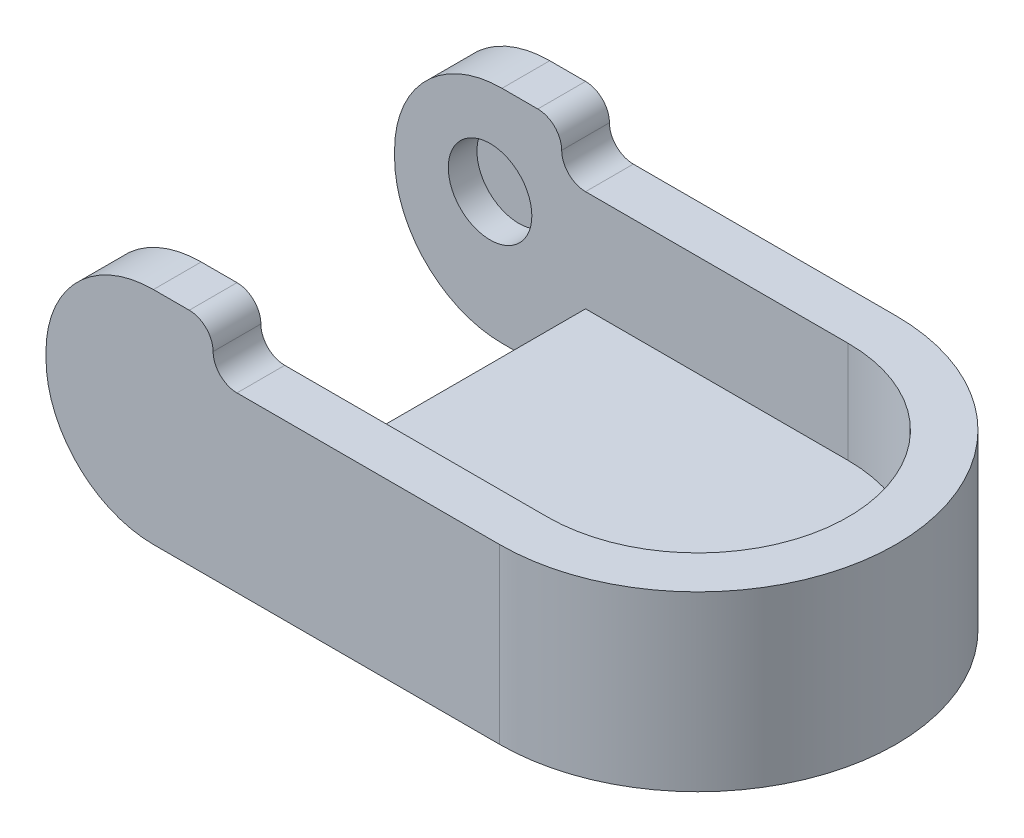
ISO-10303-21;
HEADER;
FILE_DESCRIPTION(('STEP AP214'),'2;1');
FILE_NAME('part.step','',(''),(''),'','','');
FILE_SCHEMA(('AUTOMOTIVE_DESIGN { 1 0 10303 214 1 1 1 1 }'));
ENDSEC;
DATA;
#1=APPLICATION_CONTEXT('core data for automotive mechanical design processes');
#2=APPLICATION_PROTOCOL_DEFINITION('international standard','automotive_design',2000,#1);
#3=PRODUCT_CONTEXT('',#1,'mechanical');
#4=PRODUCT('Part','Part','',(#3));
#5=PRODUCT_RELATED_PRODUCT_CATEGORY('part','',(#4));
#6=PRODUCT_DEFINITION_FORMATION('','',#4);
#7=PRODUCT_DEFINITION_CONTEXT('part definition',#1,'design');
#8=PRODUCT_DEFINITION('design','',#6,#7);
#9=PRODUCT_DEFINITION_SHAPE('','',#8);
#10=(LENGTH_UNIT() NAMED_UNIT(*) SI_UNIT(.MILLI.,.METRE.));
#11=(NAMED_UNIT(*) PLANE_ANGLE_UNIT() SI_UNIT($,.RADIAN.));
#12=(NAMED_UNIT(*) SI_UNIT($,.STERADIAN.) SOLID_ANGLE_UNIT());
#13=UNCERTAINTY_MEASURE_WITH_UNIT(LENGTH_MEASURE(1.E-05),#10,'distance_accuracy_value','');
#14=(GEOMETRIC_REPRESENTATION_CONTEXT(3) GLOBAL_UNCERTAINTY_ASSIGNED_CONTEXT((#13)) GLOBAL_UNIT_ASSIGNED_CONTEXT((#10,
#11,#12)) REPRESENTATION_CONTEXT('',''));
#15=CARTESIAN_POINT('',(0.,0.,0.));
#16=DIRECTION('',(0.,0.,1.));
#17=DIRECTION('',(1.,0.,0.));
#18=AXIS2_PLACEMENT_3D('',#15,#16,#17);
#19=CARTESIAN_POINT('',(0.,3.,0.));
#20=DIRECTION('',(0.,0.,-1.));
#21=DIRECTION('',(-1.,0.,0.));
#22=AXIS2_PLACEMENT_3D('',#19,#20,#21);
#23=PLANE('',#22);
#24=DIRECTION('',(1.,0.,0.));
#25=VECTOR('',#24,1.);
#26=CARTESIAN_POINT('',(0.,7.25,0.));
#27=LINE('',#26,#25);
#28=CARTESIAN_POINT('',(6.,7.25,0.));
#29=VERTEX_POINT('',#28);
#30=CARTESIAN_POINT('',(17.,7.25,0.));
#31=VERTEX_POINT('',#30);
#32=EDGE_CURVE('E213',#29,#31,#27,.T.);
#33=ORIENTED_EDGE('',*,*,#32,.F.);
#34=CARTESIAN_POINT('',(6.,8.25,0.));
#35=DIRECTION('',(0.,0.,-1.));
#36=DIRECTION('',(-1.,0.,0.));
#37=AXIS2_PLACEMENT_3D('',#34,#35,#36);
#38=CIRCLE('',#37,1.);
#39=CARTESIAN_POINT('',(5.,8.25,0.));
#40=VERTEX_POINT('',#39);
#41=EDGE_CURVE('E335',#29,#40,#38,.T.);
#42=ORIENTED_EDGE('',*,*,#41,.T.);
#43=CARTESIAN_POINT('',(4.,8.25,0.));
#44=DIRECTION('',(0.,0.,-1.));
#45=DIRECTION('',(-1.,0.,0.));
#46=AXIS2_PLACEMENT_3D('',#43,#44,#45);
#47=CIRCLE('',#46,1.);
#48=CARTESIAN_POINT('',(4.,9.25,0.));
#49=VERTEX_POINT('',#48);
#50=EDGE_CURVE('E325',#40,#49,#47,.F.);
#51=ORIENTED_EDGE('',*,*,#50,.T.);
#52=DIRECTION('',(-1.,0.,0.));
#53=VECTOR('',#52,1.);
#54=CARTESIAN_POINT('',(5.,9.25,0.));
#55=LINE('',#54,#53);
#56=CARTESIAN_POINT('',(2.5,9.25,0.));
#57=VERTEX_POINT('',#56);
#58=EDGE_CURVE('E492',#49,#57,#55,.T.);
#59=ORIENTED_EDGE('',*,*,#58,.T.);
#60=CARTESIAN_POINT('',(2.5,4.75,0.));
#61=DIRECTION('',(0.,0.,-1.));
#62=DIRECTION('',(-1.,0.,0.));
#63=AXIS2_PLACEMENT_3D('',#60,#61,#62);
#64=CIRCLE('',#63,4.5);
#65=CARTESIAN_POINT('',(-2.,4.75,0.));
#66=VERTEX_POINT('',#65);
#67=EDGE_CURVE('E283',#57,#66,#64,.F.);
#68=ORIENTED_EDGE('',*,*,#67,.T.);
#69=DIRECTION('',(0.,-1.,0.));
#70=VECTOR('',#69,1.);
#71=CARTESIAN_POINT('',(-2.,9.25,0.));
#72=LINE('',#71,#70);
#73=CARTESIAN_POINT('',(-2.,4.5,0.));
#74=VERTEX_POINT('',#73);
#75=EDGE_CURVE('E488',#66,#74,#72,.T.);
#76=ORIENTED_EDGE('',*,*,#75,.T.);
#77=CARTESIAN_POINT('',(2.5,4.5,0.));
#78=DIRECTION('',(0.,0.,-1.));
#79=DIRECTION('',(-1.,0.,0.));
#80=AXIS2_PLACEMENT_3D('',#77,#78,#79);
#81=CIRCLE('',#80,4.5);
#82=CARTESIAN_POINT('',(2.5,0.,0.));
#83=VERTEX_POINT('',#82);
#84=EDGE_CURVE('E285',#74,#83,#81,.F.);
#85=ORIENTED_EDGE('',*,*,#84,.T.);
#86=DIRECTION('',(1.,0.,0.));
#87=VECTOR('',#86,1.);
#88=CARTESIAN_POINT('',(0.,0.,0.));
#89=LINE('',#88,#87);
#90=CARTESIAN_POINT('',(17.,0.,0.));
#91=VERTEX_POINT('',#90);
#92=EDGE_CURVE('E222',#83,#91,#89,.T.);
#93=ORIENTED_EDGE('',*,*,#92,.T.);
#94=DIRECTION('',(0.,-1.,0.));
#95=VECTOR('',#94,1.);
#96=CARTESIAN_POINT('',(17.,3.,0.));
#97=LINE('',#96,#95);
#98=EDGE_CURVE('E248',#31,#91,#97,.T.);
#99=ORIENTED_EDGE('',*,*,#98,.F.);
#100=EDGE_LOOP('',(#33,#42,#51,#59,#68,#76,#85,#93,#99));
#101=FACE_BOUND('',#100,.T.);
#102=ADVANCED_FACE('F42',(#101),#23,.F.);
#103=CARTESIAN_POINT('',(17.,3.,-8.3));
#104=DIRECTION('',(0.,-1.,0.));
#105=DIRECTION('',(0.,0.,-1.));
#106=AXIS2_PLACEMENT_3D('',#103,#104,#105);
#107=CYLINDRICAL_SURFACE('',#106,8.3);
#108=CARTESIAN_POINT('',(17.,0.,-8.3));
#109=DIRECTION('',(0.,1.,0.));
#110=DIRECTION('',(0.,0.,1.));
#111=AXIS2_PLACEMENT_3D('',#108,#109,#110);
#112=CIRCLE('',#111,8.3);
#113=CARTESIAN_POINT('',(17.,0.,-16.6));
#114=VERTEX_POINT('',#113);
#115=EDGE_CURVE('E258',#91,#114,#112,.T.);
#116=ORIENTED_EDGE('',*,*,#115,.T.);
#117=DIRECTION('',(0.,-1.,0.));
#118=VECTOR('',#117,1.);
#119=CARTESIAN_POINT('',(17.,3.,-16.6));
#120=LINE('',#119,#118);
#121=CARTESIAN_POINT('',(17.,7.25,-16.6));
#122=VERTEX_POINT('',#121);
#123=EDGE_CURVE('E274',#122,#114,#120,.T.);
#124=ORIENTED_EDGE('',*,*,#123,.F.);
#125=CARTESIAN_POINT('',(17.,7.25,-8.3));
#126=DIRECTION('',(0.,1.,0.));
#127=DIRECTION('',(0.,0.,1.));
#128=AXIS2_PLACEMENT_3D('',#125,#126,#127);
#129=CIRCLE('',#128,8.3);
#130=EDGE_CURVE('E239',#31,#122,#129,.T.);
#131=ORIENTED_EDGE('',*,*,#130,.F.);
#132=ORIENTED_EDGE('',*,*,#98,.T.);
#133=EDGE_LOOP('',(#116,#124,#131,#132));
#134=FACE_BOUND('',#133,.T.);
#135=ADVANCED_FACE('F396',(#134),#107,.T.);
#136=CARTESIAN_POINT('',(17.,3.,-16.6));
#137=DIRECTION('',(0.,0.,1.));
#138=DIRECTION('',(1.,0.,0.));
#139=AXIS2_PLACEMENT_3D('',#136,#137,#138);
#140=PLANE('',#139);
#141=DIRECTION('',(1.,0.,0.));
#142=VECTOR('',#141,1.);
#143=CARTESIAN_POINT('',(5.,9.25,-16.6));
#144=LINE('',#143,#142);
#145=CARTESIAN_POINT('',(2.5,9.25,-16.6));
#146=VERTEX_POINT('',#145);
#147=CARTESIAN_POINT('',(4.,9.25,-16.6));
#148=VERTEX_POINT('',#147);
#149=EDGE_CURVE('E786',#146,#148,#144,.T.);
#150=ORIENTED_EDGE('',*,*,#149,.T.);
#151=CARTESIAN_POINT('',(4.,8.25,-16.6));
#152=DIRECTION('',(0.,0.,1.));
#153=DIRECTION('',(1.,0.,0.));
#154=AXIS2_PLACEMENT_3D('',#151,#152,#153);
#155=CIRCLE('',#154,1.);
#156=CARTESIAN_POINT('',(5.,8.25,-16.6));
#157=VERTEX_POINT('',#156);
#158=EDGE_CURVE('E321',#148,#157,#155,.F.);
#159=ORIENTED_EDGE('',*,*,#158,.T.);
#160=CARTESIAN_POINT('',(6.,8.25,-16.6));
#161=DIRECTION('',(0.,0.,1.));
#162=DIRECTION('',(1.,0.,0.));
#163=AXIS2_PLACEMENT_3D('',#160,#161,#162);
#164=CIRCLE('',#163,1.);
#165=CARTESIAN_POINT('',(6.,7.25,-16.6));
#166=VERTEX_POINT('',#165);
#167=EDGE_CURVE('E331',#157,#166,#164,.T.);
#168=ORIENTED_EDGE('',*,*,#167,.T.);
#169=DIRECTION('',(-1.,0.,0.));
#170=VECTOR('',#169,1.);
#171=CARTESIAN_POINT('',(0.,7.25,-16.6));
#172=LINE('',#171,#170);
#173=EDGE_CURVE('E242',#122,#166,#172,.T.);
#174=ORIENTED_EDGE('',*,*,#173,.F.);
#175=ORIENTED_EDGE('',*,*,#123,.T.);
#176=DIRECTION('',(-1.,0.,0.));
#177=VECTOR('',#176,1.);
#178=CARTESIAN_POINT('',(17.,0.,-16.6));
#179=LINE('',#178,#177);
#180=CARTESIAN_POINT('',(2.5,0.,-16.6));
#181=VERTEX_POINT('',#180);
#182=EDGE_CURVE('E260',#114,#181,#179,.T.);
#183=ORIENTED_EDGE('',*,*,#182,.T.);
#184=CARTESIAN_POINT('',(2.5,4.5,-16.6));
#185=DIRECTION('',(0.,0.,1.));
#186=DIRECTION('',(1.,0.,0.));
#187=AXIS2_PLACEMENT_3D('',#184,#185,#186);
#188=CIRCLE('',#187,4.5);
#189=CARTESIAN_POINT('',(-2.,4.5,-16.6));
#190=VERTEX_POINT('',#189);
#191=EDGE_CURVE('E299',#181,#190,#188,.F.);
#192=ORIENTED_EDGE('',*,*,#191,.T.);
#193=DIRECTION('',(0.,1.,0.));
#194=VECTOR('',#193,1.);
#195=CARTESIAN_POINT('',(-2.,9.25,-16.6));
#196=LINE('',#195,#194);
#197=CARTESIAN_POINT('',(-2.,4.75,-16.6));
#198=VERTEX_POINT('',#197);
#199=EDGE_CURVE('E342',#190,#198,#196,.T.);
#200=ORIENTED_EDGE('',*,*,#199,.T.);
#201=CARTESIAN_POINT('',(2.5,4.75,-16.6));
#202=DIRECTION('',(0.,0.,1.));
#203=DIRECTION('',(1.,0.,0.));
#204=AXIS2_PLACEMENT_3D('',#201,#202,#203);
#205=CIRCLE('',#204,4.5);
#206=EDGE_CURVE('E297',#198,#146,#205,.F.);
#207=ORIENTED_EDGE('',*,*,#206,.T.);
#208=EDGE_LOOP('',(#150,#159,#168,#174,#175,#183,#192,#200,#207));
#209=FACE_BOUND('',#208,.T.);
#210=ADVANCED_FACE('F402',(#209),#140,.F.);
#211=CARTESIAN_POINT('',(0.,3.,-14.6));
#212=DIRECTION('',(0.,0.,-1.));
#213=DIRECTION('',(-1.,0.,0.));
#214=AXIS2_PLACEMENT_3D('',#211,#212,#213);
#215=PLANE('',#214);
#216=DIRECTION('',(1.,0.,0.));
#217=VECTOR('',#216,1.);
#218=CARTESIAN_POINT('',(0.,7.25,-14.6));
#219=LINE('',#218,#217);
#220=CARTESIAN_POINT('',(6.,7.25,-14.6));
#221=VERTEX_POINT('',#220);
#222=CARTESIAN_POINT('',(17.,7.25,-14.6));
#223=VERTEX_POINT('',#222);
#224=EDGE_CURVE('E229',#221,#223,#219,.T.);
#225=ORIENTED_EDGE('',*,*,#224,.F.);
#226=CARTESIAN_POINT('',(6.,8.25,-14.6));
#227=DIRECTION('',(0.,0.,-1.));
#228=DIRECTION('',(-1.,0.,0.));
#229=AXIS2_PLACEMENT_3D('',#226,#227,#228);
#230=CIRCLE('',#229,1.);
#231=CARTESIAN_POINT('',(5.,8.25,-14.6));
#232=VERTEX_POINT('',#231);
#233=EDGE_CURVE('E333',#221,#232,#230,.T.);
#234=ORIENTED_EDGE('',*,*,#233,.T.);
#235=CARTESIAN_POINT('',(4.,8.25,-14.6));
#236=DIRECTION('',(0.,0.,-1.));
#237=DIRECTION('',(-1.,0.,0.));
#238=AXIS2_PLACEMENT_3D('',#235,#236,#237);
#239=CIRCLE('',#238,1.);
#240=CARTESIAN_POINT('',(4.,9.25,-14.6));
#241=VERTEX_POINT('',#240);
#242=EDGE_CURVE('E323',#232,#241,#239,.F.);
#243=ORIENTED_EDGE('',*,*,#242,.T.);
#244=DIRECTION('',(1.,0.,0.));
#245=VECTOR('',#244,1.);
#246=CARTESIAN_POINT('',(5.,9.25,-14.6));
#247=LINE('',#246,#245);
#248=CARTESIAN_POINT('',(2.5,9.25,-14.6));
#249=VERTEX_POINT('',#248);
#250=EDGE_CURVE('E494',#249,#241,#247,.T.);
#251=ORIENTED_EDGE('',*,*,#250,.F.);
#252=CARTESIAN_POINT('',(2.5,4.75,-14.6));
#253=DIRECTION('',(0.,0.,-1.));
#254=DIRECTION('',(-1.,0.,0.));
#255=AXIS2_PLACEMENT_3D('',#252,#253,#254);
#256=CIRCLE('',#255,4.5);
#257=CARTESIAN_POINT('',(-2.,4.75,-14.6));
#258=VERTEX_POINT('',#257);
#259=EDGE_CURVE('E306',#249,#258,#256,.F.);
#260=ORIENTED_EDGE('',*,*,#259,.T.);
#261=DIRECTION('',(0.,1.,0.));
#262=VECTOR('',#261,1.);
#263=CARTESIAN_POINT('',(-2.,9.25,-14.6));
#264=LINE('',#263,#262);
#265=CARTESIAN_POINT('',(-2.,4.5,-14.6));
#266=VERTEX_POINT('',#265);
#267=EDGE_CURVE('E790',#266,#258,#264,.T.);
#268=ORIENTED_EDGE('',*,*,#267,.F.);
#269=CARTESIAN_POINT('',(2.5,4.5,-14.6));
#270=DIRECTION('',(0.,0.,-1.));
#271=DIRECTION('',(-1.,0.,0.));
#272=AXIS2_PLACEMENT_3D('',#269,#270,#271);
#273=CIRCLE('',#272,4.5);
#274=CARTESIAN_POINT('',(2.5,0.,-14.6));
#275=VERTEX_POINT('',#274);
#276=EDGE_CURVE('E308',#266,#275,#273,.F.);
#277=ORIENTED_EDGE('',*,*,#276,.T.);
#278=DIRECTION('',(1.,0.,0.));
#279=VECTOR('',#278,1.);
#280=CARTESIAN_POINT('',(0.,0.,-14.6));
#281=LINE('',#280,#279);
#282=CARTESIAN_POINT('',(6.,0.,-14.6));
#283=VERTEX_POINT('',#282);
#284=EDGE_CURVE('E263',#275,#283,#281,.T.);
#285=ORIENTED_EDGE('',*,*,#284,.T.);
#286=DIRECTION('',(0.,-1.,0.));
#287=VECTOR('',#286,1.);
#288=CARTESIAN_POINT('',(6.,3.,-14.6));
#289=LINE('',#288,#287);
#290=CARTESIAN_POINT('',(6.,3.,-14.6));
#291=VERTEX_POINT('',#290);
#292=EDGE_CURVE('E271',#291,#283,#289,.T.);
#293=ORIENTED_EDGE('',*,*,#292,.F.);
#294=DIRECTION('',(1.,0.,0.));
#295=VECTOR('',#294,1.);
#296=CARTESIAN_POINT('',(0.,3.,-14.6));
#297=LINE('',#296,#295);
#298=CARTESIAN_POINT('',(17.,3.,-14.6));
#299=VERTEX_POINT('',#298);
#300=EDGE_CURVE('E247',#291,#299,#297,.T.);
#301=ORIENTED_EDGE('',*,*,#300,.T.);
#302=DIRECTION('',(0.,-1.,0.));
#303=VECTOR('',#302,1.);
#304=CARTESIAN_POINT('',(17.,7.25,-14.6));
#305=LINE('',#304,#303);
#306=EDGE_CURVE('E223',#223,#299,#305,.T.);
#307=ORIENTED_EDGE('',*,*,#306,.F.);
#308=EDGE_LOOP('',(#225,#234,#243,#251,#260,#268,#277,#285,#293,#301,#307));
#309=FACE_BOUND('',#308,.T.);
#310=CARTESIAN_POINT('',(2.,5.25,-14.6));
#311=DIRECTION('',(0.,0.,1.));
#312=DIRECTION('',(1.,0.,0.));
#313=AXIS2_PLACEMENT_3D('',#310,#311,#312);
#314=CIRCLE('',#313,1.75);
#315=CARTESIAN_POINT('',(3.75,5.25,-14.6));
#316=VERTEX_POINT('',#315);
#317=EDGE_CURVE('E235',#316,#316,#314,.T.);
#318=ORIENTED_EDGE('',*,*,#317,.F.);
#319=EDGE_LOOP('',(#318));
#320=FACE_BOUND('',#319,.T.);
#321=ADVANCED_FACE('F458',(#309,#320),#215,.F.);
#322=CARTESIAN_POINT('',(6.,3.,-14.6));
#323=DIRECTION('',(1.,0.,0.));
#324=DIRECTION('',(0.,0.,-1.));
#325=AXIS2_PLACEMENT_3D('',#322,#323,#324);
#326=PLANE('',#325);
#327=DIRECTION('',(0.,0.,1.));
#328=VECTOR('',#327,1.);
#329=CARTESIAN_POINT('',(6.,0.,-14.6));
#330=LINE('',#329,#328);
#331=CARTESIAN_POINT('',(6.,0.,-2.));
#332=VERTEX_POINT('',#331);
#333=EDGE_CURVE('E265',#283,#332,#330,.T.);
#334=ORIENTED_EDGE('',*,*,#333,.T.);
#335=DIRECTION('',(0.,-1.,0.));
#336=VECTOR('',#335,1.);
#337=CARTESIAN_POINT('',(6.,3.,-2.));
#338=LINE('',#337,#336);
#339=CARTESIAN_POINT('',(6.,3.,-2.));
#340=VERTEX_POINT('',#339);
#341=EDGE_CURVE('E255',#340,#332,#338,.T.);
#342=ORIENTED_EDGE('',*,*,#341,.F.);
#343=DIRECTION('',(0.,0.,1.));
#344=VECTOR('',#343,1.);
#345=CARTESIAN_POINT('',(6.,3.,-14.6));
#346=LINE('',#345,#344);
#347=EDGE_CURVE('E252',#291,#340,#346,.T.);
#348=ORIENTED_EDGE('',*,*,#347,.F.);
#349=ORIENTED_EDGE('',*,*,#292,.T.);
#350=EDGE_LOOP('',(#334,#342,#348,#349));
#351=FACE_BOUND('',#350,.T.);
#352=ADVANCED_FACE('F505',(#351),#326,.F.);
#353=CARTESIAN_POINT('',(6.,3.,-2.));
#354=DIRECTION('',(0.,0.,1.));
#355=DIRECTION('',(1.,0.,0.));
#356=AXIS2_PLACEMENT_3D('',#353,#354,#355);
#357=PLANE('',#356);
#358=DIRECTION('',(-1.,0.,0.));
#359=VECTOR('',#358,1.);
#360=CARTESIAN_POINT('',(5.,9.25,-2.));
#361=LINE('',#360,#359);
#362=CARTESIAN_POINT('',(4.,9.25,-2.));
#363=VERTEX_POINT('',#362);
#364=CARTESIAN_POINT('',(2.5,9.25,-2.));
#365=VERTEX_POINT('',#364);
#366=EDGE_CURVE('E483',#363,#365,#361,.T.);
#367=ORIENTED_EDGE('',*,*,#366,.F.);
#368=CARTESIAN_POINT('',(4.,8.25,-2.));
#369=DIRECTION('',(0.,0.,1.));
#370=DIRECTION('',(1.,0.,0.));
#371=AXIS2_PLACEMENT_3D('',#368,#369,#370);
#372=CIRCLE('',#371,1.);
#373=CARTESIAN_POINT('',(5.,8.25,-2.));
#374=VERTEX_POINT('',#373);
#375=EDGE_CURVE('E329',#363,#374,#372,.F.);
#376=ORIENTED_EDGE('',*,*,#375,.T.);
#377=CARTESIAN_POINT('',(6.,8.25,-2.));
#378=DIRECTION('',(0.,0.,1.));
#379=DIRECTION('',(1.,0.,0.));
#380=AXIS2_PLACEMENT_3D('',#377,#378,#379);
#381=CIRCLE('',#380,1.);
#382=CARTESIAN_POINT('',(6.,7.25,-2.));
#383=VERTEX_POINT('',#382);
#384=EDGE_CURVE('E208',#374,#383,#381,.T.);
#385=ORIENTED_EDGE('',*,*,#384,.T.);
#386=DIRECTION('',(1.,0.,0.));
#387=VECTOR('',#386,1.);
#388=CARTESIAN_POINT('',(0.,7.25,-2.));
#389=LINE('',#388,#387);
#390=CARTESIAN_POINT('',(17.,7.25,-2.));
#391=VERTEX_POINT('',#390);
#392=EDGE_CURVE('E200',#383,#391,#389,.T.);
#393=ORIENTED_EDGE('',*,*,#392,.T.);
#394=DIRECTION('',(0.,-1.,0.));
#395=VECTOR('',#394,1.);
#396=CARTESIAN_POINT('',(17.,7.25,-2.));
#397=LINE('',#396,#395);
#398=CARTESIAN_POINT('',(17.,3.,-2.));
#399=VERTEX_POINT('',#398);
#400=EDGE_CURVE('E205',#391,#399,#397,.T.);
#401=ORIENTED_EDGE('',*,*,#400,.T.);
#402=DIRECTION('',(1.,0.,0.));
#403=VECTOR('',#402,1.);
#404=CARTESIAN_POINT('',(0.,3.,-2.));
#405=LINE('',#404,#403);
#406=EDGE_CURVE('E245',#340,#399,#405,.T.);
#407=ORIENTED_EDGE('',*,*,#406,.F.);
#408=ORIENTED_EDGE('',*,*,#341,.T.);
#409=DIRECTION('',(-1.,0.,0.));
#410=VECTOR('',#409,1.);
#411=CARTESIAN_POINT('',(6.,0.,-2.));
#412=LINE('',#411,#410);
#413=CARTESIAN_POINT('',(2.5,0.,-2.));
#414=VERTEX_POINT('',#413);
#415=EDGE_CURVE('E256',#332,#414,#412,.T.);
#416=ORIENTED_EDGE('',*,*,#415,.T.);
#417=CARTESIAN_POINT('',(2.5,4.5,-2.));
#418=DIRECTION('',(0.,0.,1.));
#419=DIRECTION('',(1.,0.,0.));
#420=AXIS2_PLACEMENT_3D('',#417,#418,#419);
#421=CIRCLE('',#420,4.5);
#422=CARTESIAN_POINT('',(-2.,4.5,-2.));
#423=VERTEX_POINT('',#422);
#424=EDGE_CURVE('E295',#414,#423,#421,.F.);
#425=ORIENTED_EDGE('',*,*,#424,.T.);
#426=DIRECTION('',(0.,-1.,0.));
#427=VECTOR('',#426,1.);
#428=CARTESIAN_POINT('',(-2.,9.25,-2.));
#429=LINE('',#428,#427);
#430=CARTESIAN_POINT('',(-2.,4.75,-2.));
#431=VERTEX_POINT('',#430);
#432=EDGE_CURVE('E475',#431,#423,#429,.T.);
#433=ORIENTED_EDGE('',*,*,#432,.F.);
#434=CARTESIAN_POINT('',(2.5,4.75,-2.));
#435=DIRECTION('',(0.,0.,1.));
#436=DIRECTION('',(1.,0.,0.));
#437=AXIS2_PLACEMENT_3D('',#434,#435,#436);
#438=CIRCLE('',#437,4.5);
#439=EDGE_CURVE('E292',#431,#365,#438,.F.);
#440=ORIENTED_EDGE('',*,*,#439,.T.);
#441=EDGE_LOOP('',(#367,#376,#385,#393,#401,#407,#408,#416,#425,#433,#440));
#442=FACE_BOUND('',#441,.T.);
#443=CARTESIAN_POINT('',(2.,5.25,-2.));
#444=DIRECTION('',(0.,0.,-1.));
#445=DIRECTION('',(-1.,0.,0.));
#446=AXIS2_PLACEMENT_3D('',#443,#444,#445);
#447=CIRCLE('',#446,1.75);
#448=CARTESIAN_POINT('',(0.25,5.25,-2.));
#449=VERTEX_POINT('',#448);
#450=EDGE_CURVE('E482',#449,#449,#447,.T.);
#451=ORIENTED_EDGE('',*,*,#450,.F.);
#452=EDGE_LOOP('',(#451));
#453=FACE_BOUND('',#452,.T.);
#454=ADVANCED_FACE('F203',(#442,#453),#357,.F.);
#455=CARTESIAN_POINT('',(17.,3.,-8.3));
#456=DIRECTION('',(0.,1.,0.));
#457=DIRECTION('',(0.,0.,1.));
#458=AXIS2_PLACEMENT_3D('',#455,#456,#457);
#459=PLANE('',#458);
#460=ORIENTED_EDGE('',*,*,#300,.F.);
#461=ORIENTED_EDGE('',*,*,#347,.T.);
#462=ORIENTED_EDGE('',*,*,#406,.T.);
#463=CARTESIAN_POINT('',(17.,3.,-8.3));
#464=DIRECTION('',(0.,1.,0.));
#465=DIRECTION('',(0.,0.,1.));
#466=AXIS2_PLACEMENT_3D('',#463,#464,#465);
#467=CIRCLE('',#466,6.3);
#468=EDGE_CURVE('E221',#399,#299,#467,.T.);
#469=ORIENTED_EDGE('',*,*,#468,.T.);
#470=EDGE_LOOP('',(#460,#461,#462,#469));
#471=FACE_BOUND('',#470,.T.);
#472=ADVANCED_FACE('F376',(#471),#459,.T.);
#473=CARTESIAN_POINT('',(17.,0.,-8.3));
#474=DIRECTION('',(0.,1.,0.));
#475=DIRECTION('',(0.,0.,1.));
#476=AXIS2_PLACEMENT_3D('',#473,#474,#475);
#477=PLANE('',#476);
#478=ORIENTED_EDGE('',*,*,#92,.F.);
#479=DIRECTION('',(0.,0.,1.));
#480=VECTOR('',#479,1.);
#481=CARTESIAN_POINT('',(2.5,0.,-2.));
#482=LINE('',#481,#480);
#483=EDGE_CURVE('E290',#83,#414,#482,.F.);
#484=ORIENTED_EDGE('',*,*,#483,.T.);
#485=ORIENTED_EDGE('',*,*,#415,.F.);
#486=ORIENTED_EDGE('',*,*,#333,.F.);
#487=ORIENTED_EDGE('',*,*,#284,.F.);
#488=DIRECTION('',(0.,0.,-1.));
#489=VECTOR('',#488,1.);
#490=CARTESIAN_POINT('',(2.5,0.,-16.6));
#491=LINE('',#490,#489);
#492=EDGE_CURVE('E287',#275,#181,#491,.T.);
#493=ORIENTED_EDGE('',*,*,#492,.T.);
#494=ORIENTED_EDGE('',*,*,#182,.F.);
#495=ORIENTED_EDGE('',*,*,#115,.F.);
#496=EDGE_LOOP('',(#478,#484,#485,#486,#487,#493,#494,#495));
#497=FACE_BOUND('',#496,.T.);
#498=ADVANCED_FACE('F374',(#497),#477,.F.);
#499=CARTESIAN_POINT('',(17.,7.25,-8.3));
#500=DIRECTION('',(0.,-1.,0.));
#501=DIRECTION('',(0.,0.,-1.));
#502=AXIS2_PLACEMENT_3D('',#499,#500,#501);
#503=CYLINDRICAL_SURFACE('',#502,6.3);
#504=DIRECTION('',(0.,-1.,0.));
#505=VECTOR('',#504,1.);
#506=CARTESIAN_POINT('',(22.8,7.25,-10.7596747752498));
#507=LINE('',#506,#505);
#508=CARTESIAN_POINT('',(22.8,5.175,-10.7596747752498));
#509=VERTEX_POINT('',#508);
#510=CARTESIAN_POINT('',(22.8,5.075,-10.7596747752498));
#511=VERTEX_POINT('',#510);
#512=EDGE_CURVE('E348',#509,#511,#507,.T.);
#513=ORIENTED_EDGE('',*,*,#512,.F.);
#514=CARTESIAN_POINT('',(22.8,5.175,-10.7596747752498));
#515=CARTESIAN_POINT('',(22.7999864558682,5.1871264195243,-10.7597042162891));
#516=CARTESIAN_POINT('',(22.8004405231236,5.19921054811083,-10.7586361172509));
#517=CARTESIAN_POINT('',(22.8021592569291,5.22285129238407,-10.7545785440023));
#518=CARTESIAN_POINT('',(22.8034143092716,5.23441244596859,-10.7516118573506));
#519=CARTESIAN_POINT('',(22.8069815336115,5.25943112669933,-10.743151531393));
#520=CARTESIAN_POINT('',(22.809469807881,5.27271778369414,-10.7372351881495));
#521=CARTESIAN_POINT('',(22.8152199529779,5.29812139498308,-10.7234836855973));
#522=CARTESIAN_POINT('',(22.8184855416627,5.31023232131025,-10.715639298485));
#523=CARTESIAN_POINT('',(22.8276241911114,5.34000838790375,-10.6935348001315));
#524=CARTESIAN_POINT('',(22.8339014351518,5.3567524598264,-10.6782142848987));
#525=CARTESIAN_POINT('',(22.8471533489983,5.3876327465902,-10.6454452224037));
#526=CARTESIAN_POINT('',(22.8541293406169,5.40176386922018,-10.6279926276795));
#527=CARTESIAN_POINT('',(22.8684404299329,5.42794040556939,-10.5916781372786));
#528=CARTESIAN_POINT('',(22.875776333811,5.43998083451603,-10.5728130228474));
#529=CARTESIAN_POINT('',(22.8905923498819,5.46234047502125,-10.5341336159722));
#530=CARTESIAN_POINT('',(22.8980726032882,5.47265789470689,-10.5143183626331));
#531=CARTESIAN_POINT('',(22.9205552968915,5.50153144922978,-10.4538037972961));
#532=CARTESIAN_POINT('',(22.935573798924,5.517965789839,-10.4121008943964));
#533=CARTESIAN_POINT('',(22.9618823087952,5.54369058199638,-10.3364685651422));
#534=CARTESIAN_POINT('',(22.9732728830876,5.5537573825321,-10.3028208903554));
#535=CARTESIAN_POINT('',(22.9956313562441,5.57194754950771,-10.2348600654334));
#536=CARTESIAN_POINT('',(23.0065991816392,5.58007057940831,-10.20054680117));
#537=CARTESIAN_POINT('',(23.0387834789186,5.60214022949184,-10.0967588031393));
#538=CARTESIAN_POINT('',(23.0592390902249,5.61375025929492,-10.026555253921));
#539=CARTESIAN_POINT('',(23.0979412659192,5.63286042091901,-9.88448177683447));
#540=CARTESIAN_POINT('',(23.1161707265114,5.6403301235183,-9.81260345443093));
#541=CARTESIAN_POINT('',(23.1501075575694,5.65234151532043,-9.6680938677373));
#542=CARTESIAN_POINT('',(23.1658172570241,5.65688592019178,-9.59546336556977));
#543=CARTESIAN_POINT('',(23.2003458160753,5.66540819475033,-9.42091111338009));
#544=CARTESIAN_POINT('',(23.2179566661449,5.66845994206176,-9.31870633239577));
#545=CARTESIAN_POINT('',(23.2481223548976,5.67253207091944,-9.11347101962385));
#546=CARTESIAN_POINT('',(23.2606743799397,5.67355132326371,-9.01044006072726));
#547=CARTESIAN_POINT('',(23.2804458186923,5.67471377289981,-8.80623979699354));
#548=CARTESIAN_POINT('',(23.2877806917376,5.67487648426247,-8.70508184569702));
#549=CARTESIAN_POINT('',(23.2951130671537,5.67498113759625,-8.5532162156834));
#550=CARTESIAN_POINT('',(23.2969455365614,5.67499280703949,-8.50259092607745));
#551=CARTESIAN_POINT('',(23.2993889918497,5.67500047510134,-8.40131111136214));
#552=CARTESIAN_POINT('',(23.2999999834443,5.67499647379326,-8.35065658639067));
#553=CARTESIAN_POINT('',(23.3,5.675,-8.3));
#554=B_SPLINE_CURVE_WITH_KNOTS('',3,(#514,#515,#516,#517,#518,#519,#520,#521,#522,#523,#524,
#525,#526,#527,#528,#529,#530,#531,#532,#533,#534,#535,#536,#537,#538,#539,#540,#541,#542,#543,
#544,#545,#546,#547,#548,#549,#550,#551,#552,#553),.UNSPECIFIED.,.F.,.F.,(4,2,2,2,2,2,2,2,2,2,2,
2,2,2,2,2,2,2,2,4),(0.,0.0362555687497454,0.0720839437013359,0.116104998025774,
0.160340990414957,0.2305860458246,0.300966586847101,0.371512696035696,0.44213172004654,
0.583614538038586,0.694329282160573,0.805063181291986,1.02692459866261,1.25039566301678,
1.47365897009185,1.78475078267059,2.09601538176851,2.40015693179648,2.55211959519513,
2.70408154772086),.UNSPECIFIED.);
#555=CARTESIAN_POINT('',(23.3,5.675,-8.3));
#556=VERTEX_POINT('',#555);
#557=EDGE_CURVE('E12',#509,#556,#554,.T.);
#558=ORIENTED_EDGE('',*,*,#557,.T.);
#559=CARTESIAN_POINT('',(23.3,5.675,-8.3));
#560=CARTESIAN_POINT('',(23.3000009045654,5.6749653857032,-8.21701204502487));
#561=CARTESIAN_POINT('',(23.2983602636951,5.67499880834973,-8.13402414680515));
#562=CARTESIAN_POINT('',(23.2918015105047,5.6749527982365,-7.96815409963561));
#563=CARTESIAN_POINT('',(23.2868824542929,5.67487333296761,-7.88527198803035));
#564=CARTESIAN_POINT('',(23.2736635756044,5.67434802234737,-7.71839204756891));
#565=CARTESIAN_POINT('',(23.2653089347171,5.67389611097117,-7.63439856386758));
#566=CARTESIAN_POINT('',(23.2452353461819,5.67209468917942,-7.46684134989888));
#567=CARTESIAN_POINT('',(23.2335171414177,5.6707453768791,-7.38327752887915));
#568=CARTESIAN_POINT('',(23.2067242486763,5.66641073437704,-7.21662393298141));
#569=CARTESIAN_POINT('',(23.1916456055466,5.66342347024618,-7.13353483601462));
#570=CARTESIAN_POINT('',(23.1581779682354,5.65477679652323,-6.96809415429795));
#571=CARTESIAN_POINT('',(23.1397865189748,5.64911540008289,-6.88574316438736));
#572=CARTESIAN_POINT('',(23.0999718993844,5.63374361366123,-6.72288347016984));
#573=CARTESIAN_POINT('',(23.0785767495356,5.62406919073553,-6.64236494076899));
#574=CARTESIAN_POINT('',(23.0443384904673,5.60488937475967,-6.52301190231105));
#575=CARTESIAN_POINT('',(23.0325766717652,5.59772437807979,-6.4834907950305));
#576=CARTESIAN_POINT('',(23.0084019780391,5.58142888257159,-6.40506296970302));
#577=CARTESIAN_POINT('',(22.9959893526934,5.57229913339597,-6.36615602338297));
#578=CARTESIAN_POINT('',(22.972934474689,5.55342758665773,-6.29621565920757));
#579=CARTESIAN_POINT('',(22.9623826065196,5.54410165065877,-6.26504130329356));
#580=CARTESIAN_POINT('',(22.9409820263757,5.52332372430826,-6.20338388595376));
#581=CARTESIAN_POINT('',(22.9301325272211,5.51186551394059,-6.17290314753705));
#582=CARTESIAN_POINT('',(22.9066373268264,5.4842670885171,-6.10842759448554));
#583=CARTESIAN_POINT('',(22.8939761282116,5.46767485964218,-6.0746289151777));
#584=CARTESIAN_POINT('',(22.8690692762653,5.42959742703632,-6.00975783501188));
#585=CARTESIAN_POINT('',(22.856821855482,5.40813721262216,-5.97867259598895));
#586=CARTESIAN_POINT('',(22.8407736719454,5.37307102225927,-5.9387454989653));
#587=CARTESIAN_POINT('',(22.8362753269447,5.36236694419417,-5.9276552181795));
#588=CARTESIAN_POINT('',(22.8277148425924,5.33960692005867,-5.90670386753937));
#589=CARTESIAN_POINT('',(22.823653278777,5.32754923208775,-5.8968444168362));
#590=CARTESIAN_POINT('',(22.8161525655972,5.30178429620852,-5.87874681793334));
#591=CARTESIAN_POINT('',(22.8127234680411,5.28805536229824,-5.87053469692087));
#592=CARTESIAN_POINT('',(22.8069202325254,5.25917940449481,-5.85669604274698));
#593=CARTESIAN_POINT('',(22.8045403956867,5.24404059590819,-5.85105553645586));
#594=CARTESIAN_POINT('',(22.8019300887313,5.2197484684144,-5.84488020821402));
#595=CARTESIAN_POINT('',(22.8012143960234,5.21093494361847,-5.84319025848225));
#596=CARTESIAN_POINT('',(22.800245809816,5.19308630607604,-5.84090482959549));
#597=CARTESIAN_POINT('',(22.7999958938142,5.18405013934112,-5.84031639179884));
#598=CARTESIAN_POINT('',(22.8,5.175,-5.84032522475023));
#599=B_SPLINE_CURVE_WITH_KNOTS('',3,(#559,#560,#561,#562,#563,#564,#565,#566,#567,#568,#569,
#570,#571,#572,#573,#574,#575,#576,#577,#578,#579,#580,#581,#582,#583,#584,#585,#586,#587,#588,
#589,#590,#591,#592,#593,#594,#595,#596,#597,#598),.UNSPECIFIED.,.F.,.F.,(4,2,2,2,2,2,2,2,2,2,2,
2,2,2,2,2,2,2,2,4),(0.,0.248947530920032,0.497966767539929,0.751123839977404,1.00422504259582,
1.25762572722253,1.51121498238288,1.76257891809214,1.88809425150473,2.01356177909496,
2.11612877849126,2.2189998024289,2.33796239549829,2.45632759761935,2.50441488367328,
2.5525647762486,2.60142407208043,2.65001462586213,2.67694691143204,2.70405077998326),.UNSPECIFIED.);
#600=CARTESIAN_POINT('',(22.8,5.175,-5.84032522475023));
#601=VERTEX_POINT('',#600);
#602=EDGE_CURVE('E56',#556,#601,#599,.T.);
#603=ORIENTED_EDGE('',*,*,#602,.T.);
#604=DIRECTION('',(0.,-1.,0.));
#605=VECTOR('',#604,1.);
#606=CARTESIAN_POINT('',(22.8,7.25,-5.84032522475023));
#607=LINE('',#606,#605);
#608=CARTESIAN_POINT('',(22.8,5.075,-5.84032522475023));
#609=VERTEX_POINT('',#608);
#610=EDGE_CURVE('E338',#609,#601,#607,.F.);
#611=ORIENTED_EDGE('',*,*,#610,.F.);
#612=CARTESIAN_POINT('',(22.8,5.075,-5.84032522475023));
#613=CARTESIAN_POINT('',(22.7999864558682,5.0628735804757,-5.84029578371093));
#614=CARTESIAN_POINT('',(22.8004405231236,5.05078945188917,-5.84136388274913));
#615=CARTESIAN_POINT('',(22.8021592569291,5.02714870761593,-5.84542145599766));
#616=CARTESIAN_POINT('',(22.8034143092716,5.01558755403141,-5.8483881426494));
#617=CARTESIAN_POINT('',(22.8069815336115,4.99056887330067,-5.85684846860698));
#618=CARTESIAN_POINT('',(22.809469807881,4.97728221630586,-5.86276481185046));
#619=CARTESIAN_POINT('',(22.8152199529779,4.95187860501692,-5.8765163144027));
#620=CARTESIAN_POINT('',(22.8184855416627,4.93976767868975,-5.88436070151502));
#621=CARTESIAN_POINT('',(22.8276241911114,4.90999161209625,-5.90646519986852));
#622=CARTESIAN_POINT('',(22.8339014351518,4.8932475401736,-5.92178571510126));
#623=CARTESIAN_POINT('',(22.8471533489983,4.8623672534098,-5.9545547775963));
#624=CARTESIAN_POINT('',(22.8541293406169,4.84823613077982,-5.97200737232048));
#625=CARTESIAN_POINT('',(22.8684404299329,4.82205959443061,-6.00832186272135));
#626=CARTESIAN_POINT('',(22.875776333811,4.81001916548397,-6.02718697715261));
#627=CARTESIAN_POINT('',(22.8905923498819,4.78765952497875,-6.06586638402782));
#628=CARTESIAN_POINT('',(22.8980726032882,4.77734210529311,-6.08568163736691));
#629=CARTESIAN_POINT('',(22.9205552968914,4.74846855077022,-6.14619620270394));
#630=CARTESIAN_POINT('',(22.935573798924,4.732034210161,-6.18789910560362));
#631=CARTESIAN_POINT('',(22.9618823087952,4.70630941800363,-6.26353143485783));
#632=CARTESIAN_POINT('',(22.9732728830876,4.6962426174679,-6.29717910964464));
#633=CARTESIAN_POINT('',(22.9956313562441,4.67805245049229,-6.36513993456663));
#634=CARTESIAN_POINT('',(23.0065991816392,4.66992942059169,-6.39945319883004));
#635=CARTESIAN_POINT('',(23.0387834789186,4.64785977050816,-6.50324119686073));
#636=CARTESIAN_POINT('',(23.0592390902249,4.63624974070508,-6.57344474607902));
#637=CARTESIAN_POINT('',(23.0979412659192,4.617139579081,-6.71551822316553));
#638=CARTESIAN_POINT('',(23.1161707265114,4.6096698764817,-6.78739654556906));
#639=CARTESIAN_POINT('',(23.1501075575694,4.59765848467957,-6.93190613226269));
#640=CARTESIAN_POINT('',(23.1658172570241,4.59311407980822,-7.00453663443022));
#641=CARTESIAN_POINT('',(23.2003458160753,4.58459180524967,-7.1790888866199));
#642=CARTESIAN_POINT('',(23.2179566661449,4.58154005793824,-7.28129366760422));
#643=CARTESIAN_POINT('',(23.2481223548976,4.57746792908056,-7.48652898037614));
#644=CARTESIAN_POINT('',(23.2606743799397,4.57644867673629,-7.58955993927274));
#645=CARTESIAN_POINT('',(23.2804458186922,4.57528622710019,-7.79376020300646));
#646=CARTESIAN_POINT('',(23.2877806917376,4.57512351573753,-7.89491815430298));
#647=CARTESIAN_POINT('',(23.2951130671537,4.57501886240376,-8.04678378431659));
#648=CARTESIAN_POINT('',(23.2969455365614,4.57500719296051,-8.09740907392255));
#649=CARTESIAN_POINT('',(23.2993889918497,4.57499952489866,-8.19868888863785));
#650=CARTESIAN_POINT('',(23.2999999834443,4.57500352620674,-8.24934341360933));
#651=CARTESIAN_POINT('',(23.3,4.575,-8.3));
#652=B_SPLINE_CURVE_WITH_KNOTS('',3,(#612,#613,#614,#615,#616,#617,#618,#619,#620,#621,#622,
#623,#624,#625,#626,#627,#628,#629,#630,#631,#632,#633,#634,#635,#636,#637,#638,#639,#640,#641,
#642,#643,#644,#645,#646,#647,#648,#649,#650,#651),.UNSPECIFIED.,.F.,.F.,(4,2,2,2,2,2,2,2,2,2,2,
2,2,2,2,2,2,2,2,4),(0.,0.036255568749746,0.0720839437013365,0.116104998025775,0.160340990414958,
0.230586045824601,0.3009665868471,0.371512696035695,0.442131720046538,0.583614538038582,
0.694329282160566,0.805063181291978,1.0269245986626,1.25039566301678,1.47365897009184,
1.78475078267059,2.09601538176851,2.40015693179647,2.55211959519513,2.70408154772086),.UNSPECIFIED.);
#653=CARTESIAN_POINT('',(23.3,4.575,-8.3));
#654=VERTEX_POINT('',#653);
#655=EDGE_CURVE('E68',#609,#654,#652,.T.);
#656=ORIENTED_EDGE('',*,*,#655,.T.);
#657=CARTESIAN_POINT('',(23.3,4.575,-8.3));
#658=CARTESIAN_POINT('',(23.3000009045654,4.5750346142968,-8.38298795497513));
#659=CARTESIAN_POINT('',(23.2983602636951,4.57500119165027,-8.46597585319484));
#660=CARTESIAN_POINT('',(23.2918015105047,4.5750472017635,-8.63184590036439));
#661=CARTESIAN_POINT('',(23.2868824542929,4.57512666703239,-8.71472801196965));
#662=CARTESIAN_POINT('',(23.2736635756044,4.57565197765263,-8.88160795243109));
#663=CARTESIAN_POINT('',(23.2653089347171,4.57610388902883,-8.96560143613242));
#664=CARTESIAN_POINT('',(23.2452353461819,4.57790531082058,-9.13315865010112));
#665=CARTESIAN_POINT('',(23.2335171414177,4.5792546231209,-9.21672247112085));
#666=CARTESIAN_POINT('',(23.2067242486763,4.58358926562296,-9.38337606701858));
#667=CARTESIAN_POINT('',(23.1916456055466,4.58657652975382,-9.46646516398538));
#668=CARTESIAN_POINT('',(23.1581779682354,4.59522320347677,-9.63190584570205));
#669=CARTESIAN_POINT('',(23.1397865189748,4.60088459991711,-9.71425683561264));
#670=CARTESIAN_POINT('',(23.0999718993844,4.61625638633877,-9.87711652983016));
#671=CARTESIAN_POINT('',(23.0785767495356,4.62593080926447,-9.957635059231));
#672=CARTESIAN_POINT('',(23.0443384904673,4.64511062524033,-10.0769880976889));
#673=CARTESIAN_POINT('',(23.0325766717652,4.65227562192021,-10.1165092049695));
#674=CARTESIAN_POINT('',(23.0084019780391,4.66857111742841,-10.194937030297));
#675=CARTESIAN_POINT('',(22.9959893526934,4.67770086660403,-10.233843976617));
#676=CARTESIAN_POINT('',(22.972934474689,4.69657241334227,-10.3037843407924));
#677=CARTESIAN_POINT('',(22.9623826065196,4.70589834934123,-10.3349586967064));
#678=CARTESIAN_POINT('',(22.9409820263757,4.72667627569174,-10.3966161140462));
#679=CARTESIAN_POINT('',(22.9301325272211,4.73813448605941,-10.427096852463));
#680=CARTESIAN_POINT('',(22.9066373268264,4.7657329114829,-10.4915724055145));
#681=CARTESIAN_POINT('',(22.8939761282116,4.78232514035782,-10.5253710848223));
#682=CARTESIAN_POINT('',(22.8690692762653,4.82040257296369,-10.5902421649881));
#683=CARTESIAN_POINT('',(22.856821855482,4.84186278737784,-10.6213274040111));
#684=CARTESIAN_POINT('',(22.8407736719454,4.87692897774074,-10.6612545010347));
#685=CARTESIAN_POINT('',(22.8362753269447,4.88763305580583,-10.6723447818205));
#686=CARTESIAN_POINT('',(22.8277148425924,4.91039307994134,-10.6932961324606));
#687=CARTESIAN_POINT('',(22.823653278777,4.92245076791225,-10.7031555831638));
#688=CARTESIAN_POINT('',(22.8161525655972,4.94821570379148,-10.7212531820667));
#689=CARTESIAN_POINT('',(22.8127234680411,4.96194463770176,-10.7294653030791));
#690=CARTESIAN_POINT('',(22.8069202325254,4.99082059550518,-10.743303957253));
#691=CARTESIAN_POINT('',(22.8045403956867,5.00595940409181,-10.7489444635441));
#692=CARTESIAN_POINT('',(22.8019300887313,5.0302515315856,-10.755119791786));
#693=CARTESIAN_POINT('',(22.8012143960234,5.03906505638153,-10.7568097415177));
#694=CARTESIAN_POINT('',(22.800245809816,5.05691369392396,-10.7590951704045));
#695=CARTESIAN_POINT('',(22.7999958938142,5.06594986065888,-10.7596836082012));
#696=CARTESIAN_POINT('',(22.8,5.075,-10.7596747752498));
#697=B_SPLINE_CURVE_WITH_KNOTS('',3,(#657,#658,#659,#660,#661,#662,#663,#664,#665,#666,#667,
#668,#669,#670,#671,#672,#673,#674,#675,#676,#677,#678,#679,#680,#681,#682,#683,#684,#685,#686,
#687,#688,#689,#690,#691,#692,#693,#694,#695,#696),.UNSPECIFIED.,.F.,.F.,(4,2,2,2,2,2,2,2,2,2,2,
2,2,2,2,2,2,2,2,4),(0.,0.248947530920032,0.497966767539928,0.751123839977403,1.00422504259582,
1.25762572722253,1.51121498238288,1.76257891809214,1.88809425150473,2.01356177909496,
2.11612877849127,2.2189998024289,2.33796239549829,2.45632759761935,2.50441488367328,
2.5525647762486,2.60142407208043,2.65001462586213,2.67694691143203,2.70405077998326),.UNSPECIFIED.);
#698=EDGE_CURVE('E357',#654,#511,#697,.T.);
#699=ORIENTED_EDGE('',*,*,#698,.T.);
#700=EDGE_LOOP('',(#513,#558,#603,#611,#656,#699));
#701=FACE_BOUND('',#700,.T.);
#702=ORIENTED_EDGE('',*,*,#468,.F.);
#703=ORIENTED_EDGE('',*,*,#400,.F.);
#704=CARTESIAN_POINT('',(17.,7.25,-8.3));
#705=DIRECTION('',(0.,1.,0.));
#706=DIRECTION('',(0.,0.,1.));
#707=AXIS2_PLACEMENT_3D('',#704,#705,#706);
#708=CIRCLE('',#707,6.3);
#709=EDGE_CURVE('E214',#391,#223,#708,.T.);
#710=ORIENTED_EDGE('',*,*,#709,.T.);
#711=ORIENTED_EDGE('',*,*,#306,.T.);
#712=EDGE_LOOP('',(#702,#703,#710,#711));
#713=FACE_BOUND('',#712,.T.);
#714=ADVANCED_FACE('F218',(#701,#713),#503,.F.);
#715=CARTESIAN_POINT('',(0.,7.25,0.));
#716=DIRECTION('',(0.,1.,0.));
#717=DIRECTION('',(0.,0.,1.));
#718=AXIS2_PLACEMENT_3D('',#715,#716,#717);
#719=PLANE('',#718);
#720=ORIENTED_EDGE('',*,*,#173,.T.);
#721=DIRECTION('',(0.,0.,-1.));
#722=VECTOR('',#721,1.);
#723=CARTESIAN_POINT('',(6.,7.25,-14.6));
#724=LINE('',#723,#722);
#725=EDGE_CURVE('E317',#166,#221,#724,.F.);
#726=ORIENTED_EDGE('',*,*,#725,.T.);
#727=ORIENTED_EDGE('',*,*,#224,.T.);
#728=ORIENTED_EDGE('',*,*,#709,.F.);
#729=ORIENTED_EDGE('',*,*,#392,.F.);
#730=DIRECTION('',(0.,0.,1.));
#731=VECTOR('',#730,1.);
#732=CARTESIAN_POINT('',(6.,7.25,0.));
#733=LINE('',#732,#731);
#734=EDGE_CURVE('E315',#383,#29,#733,.T.);
#735=ORIENTED_EDGE('',*,*,#734,.T.);
#736=ORIENTED_EDGE('',*,*,#32,.T.);
#737=ORIENTED_EDGE('',*,*,#130,.T.);
#738=EDGE_LOOP('',(#720,#726,#727,#728,#729,#735,#736,#737));
#739=FACE_BOUND('',#738,.T.);
#740=ADVANCED_FACE('F226',(#739),#719,.T.);
#741=CARTESIAN_POINT('',(2.,5.25,-15.8));
#742=DIRECTION('',(0.,0.,1.));
#743=DIRECTION('',(1.,0.,0.));
#744=AXIS2_PLACEMENT_3D('',#741,#742,#743);
#745=CYLINDRICAL_SURFACE('',#744,1.75);
#746=CARTESIAN_POINT('',(2.,5.25,-15.8));
#747=DIRECTION('',(0.,0.,1.));
#748=DIRECTION('',(1.,0.,0.));
#749=AXIS2_PLACEMENT_3D('',#746,#747,#748);
#750=CIRCLE('',#749,1.75);
#751=CARTESIAN_POINT('',(3.75,5.25,-15.8));
#752=VERTEX_POINT('',#751);
#753=EDGE_CURVE('E232',#752,#752,#750,.T.);
#754=ORIENTED_EDGE('',*,*,#753,.F.);
#755=EDGE_LOOP('',(#754));
#756=FACE_BOUND('',#755,.T.);
#757=ORIENTED_EDGE('',*,*,#317,.T.);
#758=EDGE_LOOP('',(#757));
#759=FACE_BOUND('',#758,.T.);
#760=ADVANCED_FACE('F503',(#756,#759),#745,.F.);
#761=CARTESIAN_POINT('',(0.,0.,-15.8));
#762=DIRECTION('',(0.,0.,1.));
#763=DIRECTION('',(1.,0.,0.));
#764=AXIS2_PLACEMENT_3D('',#761,#762,#763);
#765=PLANE('',#764);
#766=ORIENTED_EDGE('',*,*,#753,.T.);
#767=EDGE_LOOP('',(#766));
#768=FACE_BOUND('',#767,.T.);
#769=ADVANCED_FACE('F665',(#768),#765,.T.);
#770=CARTESIAN_POINT('',(2.,5.25,-0.800000000000001));
#771=DIRECTION('',(0.,0.,-1.));
#772=DIRECTION('',(-1.,0.,0.));
#773=AXIS2_PLACEMENT_3D('',#770,#771,#772);
#774=CYLINDRICAL_SURFACE('',#773,1.75);
#775=CARTESIAN_POINT('',(2.,5.25,-0.800000000000001));
#776=DIRECTION('',(0.,0.,-1.));
#777=DIRECTION('',(-1.,0.,0.));
#778=AXIS2_PLACEMENT_3D('',#775,#776,#777);
#779=CIRCLE('',#778,1.75);
#780=CARTESIAN_POINT('',(0.25,5.25,-0.8));
#781=VERTEX_POINT('',#780);
#782=EDGE_CURVE('E486',#781,#781,#779,.T.);
#783=ORIENTED_EDGE('',*,*,#782,.F.);
#784=EDGE_LOOP('',(#783));
#785=FACE_BOUND('',#784,.T.);
#786=ORIENTED_EDGE('',*,*,#450,.T.);
#787=EDGE_LOOP('',(#786));
#788=FACE_BOUND('',#787,.T.);
#789=ADVANCED_FACE('F672',(#785,#788),#774,.F.);
#790=CARTESIAN_POINT('',(0.,0.,-0.8));
#791=DIRECTION('',(0.,0.,-1.));
#792=DIRECTION('',(-1.,0.,0.));
#793=AXIS2_PLACEMENT_3D('',#790,#791,#792);
#794=PLANE('',#793);
#795=ORIENTED_EDGE('',*,*,#782,.T.);
#796=EDGE_LOOP('',(#795));
#797=FACE_BOUND('',#796,.T.);
#798=ADVANCED_FACE('F679',(#797),#794,.T.);
#799=CARTESIAN_POINT('',(-2.,9.25,-2.));
#800=DIRECTION('',(-1.,0.,0.));
#801=DIRECTION('',(0.,-1.,0.));
#802=AXIS2_PLACEMENT_3D('',#799,#800,#801);
#803=PLANE('',#802);
#804=ORIENTED_EDGE('',*,*,#432,.T.);
#805=DIRECTION('',(0.,0.,1.));
#806=VECTOR('',#805,1.);
#807=CARTESIAN_POINT('',(-2.,4.5,0.));
#808=LINE('',#807,#806);
#809=EDGE_CURVE('E280',#423,#74,#808,.T.);
#810=ORIENTED_EDGE('',*,*,#809,.T.);
#811=ORIENTED_EDGE('',*,*,#75,.F.);
#812=DIRECTION('',(0.,0.,1.));
#813=VECTOR('',#812,1.);
#814=CARTESIAN_POINT('',(-2.,4.75,-2.));
#815=LINE('',#814,#813);
#816=EDGE_CURVE('E250',#66,#431,#815,.F.);
#817=ORIENTED_EDGE('',*,*,#816,.T.);
#818=EDGE_LOOP('',(#804,#810,#811,#817));
#819=FACE_BOUND('',#818,.T.);
#820=ADVANCED_FACE('F478',(#819),#803,.T.);
#821=CARTESIAN_POINT('',(5.,9.25,-2.));
#822=DIRECTION('',(0.,1.,0.));
#823=DIRECTION('',(0.,0.,1.));
#824=AXIS2_PLACEMENT_3D('',#821,#822,#823);
#825=PLANE('',#824);
#826=ORIENTED_EDGE('',*,*,#58,.F.);
#827=DIRECTION('',(0.,0.,1.));
#828=VECTOR('',#827,1.);
#829=CARTESIAN_POINT('',(4.,9.25,-2.));
#830=LINE('',#829,#828);
#831=EDGE_CURVE('E327',#49,#363,#830,.F.);
#832=ORIENTED_EDGE('',*,*,#831,.T.);
#833=ORIENTED_EDGE('',*,*,#366,.T.);
#834=DIRECTION('',(0.,0.,1.));
#835=VECTOR('',#834,1.);
#836=CARTESIAN_POINT('',(2.5,9.25,-2.));
#837=LINE('',#836,#835);
#838=EDGE_CURVE('E310',#365,#57,#837,.T.);
#839=ORIENTED_EDGE('',*,*,#838,.T.);
#840=EDGE_LOOP('',(#826,#832,#833,#839));
#841=FACE_BOUND('',#840,.T.);
#842=ADVANCED_FACE('F582',(#841),#825,.T.);
#843=CARTESIAN_POINT('',(5.,9.25,-14.6));
#844=DIRECTION('',(0.,1.,0.));
#845=DIRECTION('',(0.,0.,1.));
#846=AXIS2_PLACEMENT_3D('',#843,#844,#845);
#847=PLANE('',#846);
#848=ORIENTED_EDGE('',*,*,#250,.T.);
#849=DIRECTION('',(0.,0.,-1.));
#850=VECTOR('',#849,1.);
#851=CARTESIAN_POINT('',(4.,9.25,-14.6));
#852=LINE('',#851,#850);
#853=EDGE_CURVE('E319',#241,#148,#852,.T.);
#854=ORIENTED_EDGE('',*,*,#853,.T.);
#855=ORIENTED_EDGE('',*,*,#149,.F.);
#856=DIRECTION('',(0.,0.,-1.));
#857=VECTOR('',#856,1.);
#858=CARTESIAN_POINT('',(2.5,9.25,-14.6));
#859=LINE('',#858,#857);
#860=EDGE_CURVE('E313',#146,#249,#859,.F.);
#861=ORIENTED_EDGE('',*,*,#860,.T.);
#862=EDGE_LOOP('',(#848,#854,#855,#861));
#863=FACE_BOUND('',#862,.T.);
#864=ADVANCED_FACE('F576',(#863),#847,.T.);
#865=CARTESIAN_POINT('',(-2.,9.25,-14.6));
#866=DIRECTION('',(-1.,0.,0.));
#867=DIRECTION('',(0.,0.,1.));
#868=AXIS2_PLACEMENT_3D('',#865,#866,#867);
#869=PLANE('',#868);
#870=ORIENTED_EDGE('',*,*,#199,.F.);
#871=DIRECTION('',(0.,0.,-1.));
#872=VECTOR('',#871,1.);
#873=CARTESIAN_POINT('',(-2.,4.5,-14.6));
#874=LINE('',#873,#872);
#875=EDGE_CURVE('E304',#190,#266,#874,.F.);
#876=ORIENTED_EDGE('',*,*,#875,.T.);
#877=ORIENTED_EDGE('',*,*,#267,.T.);
#878=DIRECTION('',(0.,0.,-1.));
#879=VECTOR('',#878,1.);
#880=CARTESIAN_POINT('',(-2.,4.75,-14.6));
#881=LINE('',#880,#879);
#882=EDGE_CURVE('E301',#258,#198,#881,.T.);
#883=ORIENTED_EDGE('',*,*,#882,.T.);
#884=EDGE_LOOP('',(#870,#876,#877,#883));
#885=FACE_BOUND('',#884,.T.);
#886=ADVANCED_FACE('F412',(#885),#869,.T.);
#887=CARTESIAN_POINT('',(2.5,4.5,-2.));
#888=DIRECTION('',(0.,0.,-1.));
#889=DIRECTION('',(-1.,0.,0.));
#890=AXIS2_PLACEMENT_3D('',#887,#888,#889);
#891=CYLINDRICAL_SURFACE('',#890,4.5);
#892=ORIENTED_EDGE('',*,*,#424,.F.);
#893=ORIENTED_EDGE('',*,*,#483,.F.);
#894=ORIENTED_EDGE('',*,*,#84,.F.);
#895=ORIENTED_EDGE('',*,*,#809,.F.);
#896=EDGE_LOOP('',(#892,#893,#894,#895));
#897=FACE_BOUND('',#896,.T.);
#898=ADVANCED_FACE('F408',(#897),#891,.T.);
#899=CARTESIAN_POINT('',(2.5,4.5,-8.3));
#900=DIRECTION('',(0.,0.,1.));
#901=DIRECTION('',(1.,0.,0.));
#902=AXIS2_PLACEMENT_3D('',#899,#900,#901);
#903=CYLINDRICAL_SURFACE('',#902,4.5);
#904=ORIENTED_EDGE('',*,*,#276,.F.);
#905=ORIENTED_EDGE('',*,*,#875,.F.);
#906=ORIENTED_EDGE('',*,*,#191,.F.);
#907=ORIENTED_EDGE('',*,*,#492,.F.);
#908=EDGE_LOOP('',(#904,#905,#906,#907));
#909=FACE_BOUND('',#908,.T.);
#910=ADVANCED_FACE('F411',(#909),#903,.T.);
#911=CARTESIAN_POINT('',(2.5,4.75,-2.));
#912=DIRECTION('',(0.,0.,1.));
#913=DIRECTION('',(1.,0.,0.));
#914=AXIS2_PLACEMENT_3D('',#911,#912,#913);
#915=CYLINDRICAL_SURFACE('',#914,4.5);
#916=ORIENTED_EDGE('',*,*,#439,.F.);
#917=ORIENTED_EDGE('',*,*,#816,.F.);
#918=ORIENTED_EDGE('',*,*,#67,.F.);
#919=ORIENTED_EDGE('',*,*,#838,.F.);
#920=EDGE_LOOP('',(#916,#917,#918,#919));
#921=FACE_BOUND('',#920,.T.);
#922=ADVANCED_FACE('F416',(#921),#915,.T.);
#923=CARTESIAN_POINT('',(2.5,4.75,-14.6));
#924=DIRECTION('',(0.,0.,-1.));
#925=DIRECTION('',(-1.,0.,0.));
#926=AXIS2_PLACEMENT_3D('',#923,#924,#925);
#927=CYLINDRICAL_SURFACE('',#926,4.5);
#928=ORIENTED_EDGE('',*,*,#259,.F.);
#929=ORIENTED_EDGE('',*,*,#860,.F.);
#930=ORIENTED_EDGE('',*,*,#206,.F.);
#931=ORIENTED_EDGE('',*,*,#882,.F.);
#932=EDGE_LOOP('',(#928,#929,#930,#931));
#933=FACE_BOUND('',#932,.T.);
#934=ADVANCED_FACE('F420',(#933),#927,.T.);
#935=CARTESIAN_POINT('',(4.,8.25,-14.6));
#936=DIRECTION('',(0.,0.,-1.));
#937=DIRECTION('',(-1.,0.,0.));
#938=AXIS2_PLACEMENT_3D('',#935,#936,#937);
#939=CYLINDRICAL_SURFACE('',#938,1.);
#940=ORIENTED_EDGE('',*,*,#853,.F.);
#941=ORIENTED_EDGE('',*,*,#242,.F.);
#942=DIRECTION('',(0.,0.,-1.));
#943=VECTOR('',#942,1.);
#944=CARTESIAN_POINT('',(5.,8.25,-14.6));
#945=LINE('',#944,#943);
#946=EDGE_CURVE('E339',#157,#232,#945,.F.);
#947=ORIENTED_EDGE('',*,*,#946,.F.);
#948=ORIENTED_EDGE('',*,*,#158,.F.);
#949=EDGE_LOOP('',(#940,#941,#947,#948));
#950=FACE_BOUND('',#949,.T.);
#951=ADVANCED_FACE('F424',(#950),#939,.T.);
#952=CARTESIAN_POINT('',(6.,8.25,-14.6));
#953=DIRECTION('',(0.,0.,1.));
#954=DIRECTION('',(1.,0.,0.));
#955=AXIS2_PLACEMENT_3D('',#952,#953,#954);
#956=CYLINDRICAL_SURFACE('',#955,1.);
#957=ORIENTED_EDGE('',*,*,#233,.F.);
#958=ORIENTED_EDGE('',*,*,#725,.F.);
#959=ORIENTED_EDGE('',*,*,#167,.F.);
#960=ORIENTED_EDGE('',*,*,#946,.T.);
#961=EDGE_LOOP('',(#957,#958,#959,#960));
#962=FACE_BOUND('',#961,.T.);
#963=ADVANCED_FACE('F426',(#962),#956,.F.);
#964=CARTESIAN_POINT('',(4.,8.25,-2.));
#965=DIRECTION('',(0.,0.,1.));
#966=DIRECTION('',(1.,0.,0.));
#967=AXIS2_PLACEMENT_3D('',#964,#965,#966);
#968=CYLINDRICAL_SURFACE('',#967,1.);
#969=DIRECTION('',(0.,0.,1.));
#970=VECTOR('',#969,1.);
#971=CARTESIAN_POINT('',(5.,8.25,-2.));
#972=LINE('',#971,#970);
#973=EDGE_CURVE('E343',#374,#40,#972,.T.);
#974=ORIENTED_EDGE('',*,*,#973,.F.);
#975=ORIENTED_EDGE('',*,*,#375,.F.);
#976=ORIENTED_EDGE('',*,*,#831,.F.);
#977=ORIENTED_EDGE('',*,*,#50,.F.);
#978=EDGE_LOOP('',(#974,#975,#976,#977));
#979=FACE_BOUND('',#978,.T.);
#980=ADVANCED_FACE('F429',(#979),#968,.T.);
#981=CARTESIAN_POINT('',(6.,8.25,0.));
#982=DIRECTION('',(0.,0.,-1.));
#983=DIRECTION('',(-1.,0.,0.));
#984=AXIS2_PLACEMENT_3D('',#981,#982,#983);
#985=CYLINDRICAL_SURFACE('',#984,1.);
#986=ORIENTED_EDGE('',*,*,#384,.F.);
#987=ORIENTED_EDGE('',*,*,#973,.T.);
#988=ORIENTED_EDGE('',*,*,#41,.F.);
#989=ORIENTED_EDGE('',*,*,#734,.F.);
#990=EDGE_LOOP('',(#986,#987,#988,#989));
#991=FACE_BOUND('',#990,.T.);
#992=ADVANCED_FACE('F434',(#991),#985,.F.);
#993=CARTESIAN_POINT('',(22.8,0.,0.));
#994=DIRECTION('',(-1.,0.,0.));
#995=DIRECTION('',(0.,0.,1.));
#996=AXIS2_PLACEMENT_3D('',#993,#994,#995);
#997=PLANE('',#996);
#998=ORIENTED_EDGE('',*,*,#512,.T.);
#999=DIRECTION('',(0.,0.,-1.));
#1000=VECTOR('',#999,1.);
#1001=CARTESIAN_POINT('',(22.8,5.075,0.));
#1002=LINE('',#1001,#1000);
#1003=EDGE_CURVE('E354',#511,#609,#1002,.F.);
#1004=ORIENTED_EDGE('',*,*,#1003,.T.);
#1005=ORIENTED_EDGE('',*,*,#610,.T.);
#1006=DIRECTION('',(0.,0.,1.));
#1007=VECTOR('',#1006,1.);
#1008=CARTESIAN_POINT('',(22.8,5.175,0.));
#1009=LINE('',#1008,#1007);
#1010=EDGE_CURVE('E351',#601,#509,#1009,.F.);
#1011=ORIENTED_EDGE('',*,*,#1010,.T.);
#1012=EDGE_LOOP('',(#998,#1004,#1005,#1011));
#1013=FACE_BOUND('',#1012,.T.);
#1014=ADVANCED_FACE('F388',(#1013),#997,.T.);
#1015=CARTESIAN_POINT('',(23.3,5.075,-5.8));
#1016=DIRECTION('',(0.,0.,-1.));
#1017=DIRECTION('',(-1.,0.,0.));
#1018=AXIS2_PLACEMENT_3D('',#1015,#1016,#1017);
#1019=CYLINDRICAL_SURFACE('',#1018,0.5);
#1020=ORIENTED_EDGE('',*,*,#655,.F.);
#1021=ORIENTED_EDGE('',*,*,#1003,.F.);
#1022=ORIENTED_EDGE('',*,*,#698,.F.);
#1023=EDGE_LOOP('',(#1020,#1021,#1022));
#1024=FACE_BOUND('',#1023,.T.);
#1025=ADVANCED_FACE('F367',(#1024),#1019,.T.);
#1026=CARTESIAN_POINT('',(23.3,5.175,-5.8));
#1027=DIRECTION('',(0.,0.,1.));
#1028=DIRECTION('',(1.,0.,0.));
#1029=AXIS2_PLACEMENT_3D('',#1026,#1027,#1028);
#1030=CYLINDRICAL_SURFACE('',#1029,0.5);
#1031=ORIENTED_EDGE('',*,*,#557,.F.);
#1032=ORIENTED_EDGE('',*,*,#1010,.F.);
#1033=ORIENTED_EDGE('',*,*,#602,.F.);
#1034=EDGE_LOOP('',(#1031,#1032,#1033));
#1035=FACE_BOUND('',#1034,.T.);
#1036=ADVANCED_FACE('F44',(#1035),#1030,.T.);
#1037=CLOSED_SHELL('',(#102,#135,#210,#321,#352,#454,#472,#498,#714,#740,#760,#769,#789,#798,
#820,#842,#864,#886,#898,#910,#922,#934,#951,#963,#980,#992,#1014,#1025,#1036));
#1038=MANIFOLD_SOLID_BREP('B2',#1037);
#1039=ADVANCED_BREP_SHAPE_REPRESENTATION('',(#18,#1038),#14);
#1040=SHAPE_DEFINITION_REPRESENTATION(#9,#1039);
ENDSEC;
END-ISO-10303-21;
